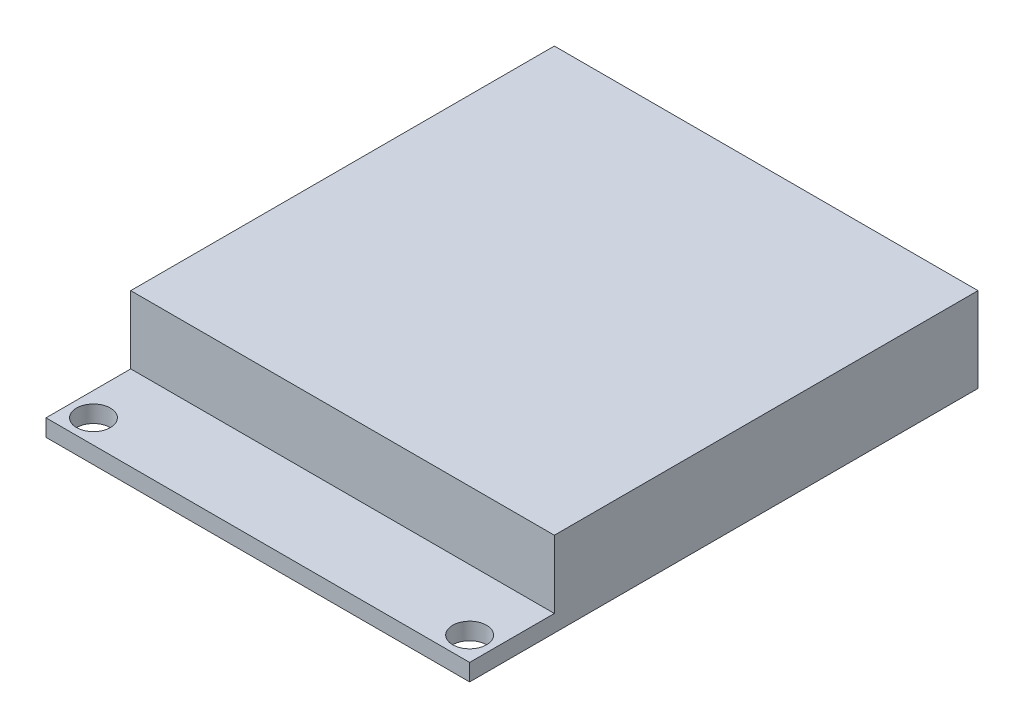
ISO-10303-21;
HEADER;
FILE_DESCRIPTION(('STEP AP214'),'2;1');
FILE_NAME('part.step','',(''),(''),'','','');
FILE_SCHEMA(('AUTOMOTIVE_DESIGN { 1 0 10303 214 1 1 1 1 }'));
ENDSEC;
DATA;
#1=APPLICATION_CONTEXT('core data for automotive mechanical design processes');
#2=APPLICATION_PROTOCOL_DEFINITION('international standard','automotive_design',2000,#1);
#3=PRODUCT_CONTEXT('',#1,'mechanical');
#4=PRODUCT('Part','Part','',(#3));
#5=PRODUCT_RELATED_PRODUCT_CATEGORY('part','',(#4));
#6=PRODUCT_DEFINITION_FORMATION('','',#4);
#7=PRODUCT_DEFINITION_CONTEXT('part definition',#1,'design');
#8=PRODUCT_DEFINITION('design','',#6,#7);
#9=PRODUCT_DEFINITION_SHAPE('','',#8);
#10=(LENGTH_UNIT() NAMED_UNIT(*) SI_UNIT(.MILLI.,.METRE.));
#11=(NAMED_UNIT(*) PLANE_ANGLE_UNIT() SI_UNIT($,.RADIAN.));
#12=(NAMED_UNIT(*) SI_UNIT($,.STERADIAN.) SOLID_ANGLE_UNIT());
#13=UNCERTAINTY_MEASURE_WITH_UNIT(LENGTH_MEASURE(1.E-05),#10,'distance_accuracy_value','');
#14=(GEOMETRIC_REPRESENTATION_CONTEXT(3) GLOBAL_UNCERTAINTY_ASSIGNED_CONTEXT((#13)) GLOBAL_UNIT_ASSIGNED_CONTEXT((#10,
#11,#12)) REPRESENTATION_CONTEXT('',''));
#15=CARTESIAN_POINT('',(0.,0.,0.));
#16=DIRECTION('',(0.,0.,1.));
#17=DIRECTION('',(1.,0.,0.));
#18=AXIS2_PLACEMENT_3D('',#15,#16,#17);
#19=CARTESIAN_POINT('',(0.,1.,0.));
#20=DIRECTION('',(0.,-1.,0.));
#21=DIRECTION('',(0.,0.,-1.));
#22=AXIS2_PLACEMENT_3D('',#19,#20,#21);
#23=PLANE('',#22);
#24=CARTESIAN_POINT('',(-11.1,1.,13.6));
#25=DIRECTION('',(0.,1.,0.));
#26=DIRECTION('',(0.,0.,1.));
#27=AXIS2_PLACEMENT_3D('',#24,#25,#26);
#28=CIRCLE('',#27,1.);
#29=CARTESIAN_POINT('',(-11.1,1.,14.6));
#30=VERTEX_POINT('',#29);
#31=EDGE_CURVE('E150',#30,#30,#28,.T.);
#32=ORIENTED_EDGE('',*,*,#31,.F.);
#33=EDGE_LOOP('',(#32));
#34=FACE_BOUND('',#33,.T.);
#35=CARTESIAN_POINT('',(11.1,1.,13.6));
#36=DIRECTION('',(0.,1.,0.));
#37=DIRECTION('',(0.,0.,1.));
#38=AXIS2_PLACEMENT_3D('',#35,#36,#37);
#39=CIRCLE('',#38,1.);
#40=CARTESIAN_POINT('',(11.1,1.,14.6));
#41=VERTEX_POINT('',#40);
#42=EDGE_CURVE('E151',#41,#41,#39,.T.);
#43=ORIENTED_EDGE('',*,*,#42,.F.);
#44=EDGE_LOOP('',(#43));
#45=FACE_BOUND('',#44,.T.);
#46=DIRECTION('',(1.,0.,0.));
#47=VECTOR('',#46,1.);
#48=CARTESIAN_POINT('',(-12.5,1.,10.));
#49=LINE('',#48,#47);
#50=CARTESIAN_POINT('',(-12.5,1.,10.));
#51=VERTEX_POINT('',#50);
#52=CARTESIAN_POINT('',(12.5,1.,10.));
#53=VERTEX_POINT('',#52);
#54=EDGE_CURVE('E51',#51,#53,#49,.T.);
#55=ORIENTED_EDGE('',*,*,#54,.F.);
#56=DIRECTION('',(0.,0.,1.));
#57=VECTOR('',#56,1.);
#58=CARTESIAN_POINT('',(-12.5,1.,15.));
#59=LINE('',#58,#57);
#60=CARTESIAN_POINT('',(-12.5,1.,15.));
#61=VERTEX_POINT('',#60);
#62=EDGE_CURVE('E137',#51,#61,#59,.T.);
#63=ORIENTED_EDGE('',*,*,#62,.T.);
#64=DIRECTION('',(1.,0.,0.));
#65=VECTOR('',#64,1.);
#66=CARTESIAN_POINT('',(-12.5,1.,15.));
#67=LINE('',#66,#65);
#68=CARTESIAN_POINT('',(12.5,1.,15.));
#69=VERTEX_POINT('',#68);
#70=EDGE_CURVE('E57',#61,#69,#67,.T.);
#71=ORIENTED_EDGE('',*,*,#70,.T.);
#72=DIRECTION('',(0.,0.,-1.));
#73=VECTOR('',#72,1.);
#74=CARTESIAN_POINT('',(12.5,1.,15.));
#75=LINE('',#74,#73);
#76=EDGE_CURVE('E86',#69,#53,#75,.T.);
#77=ORIENTED_EDGE('',*,*,#76,.T.);
#78=EDGE_LOOP('',(#55,#63,#71,#77));
#79=FACE_BOUND('',#78,.T.);
#80=ADVANCED_FACE('F36',(#34,#45,#79),#23,.F.);
#81=CARTESIAN_POINT('',(12.5,1.,15.));
#82=DIRECTION('',(-1.,0.,0.));
#83=DIRECTION('',(0.,0.,1.));
#84=AXIS2_PLACEMENT_3D('',#81,#82,#83);
#85=PLANE('',#84);
#86=DIRECTION('',(0.,0.,-1.));
#87=VECTOR('',#86,1.);
#88=CARTESIAN_POINT('',(12.5,0.,15.));
#89=LINE('',#88,#87);
#90=CARTESIAN_POINT('',(12.5,0.,15.));
#91=VERTEX_POINT('',#90);
#92=CARTESIAN_POINT('',(12.5,0.,-15.));
#93=VERTEX_POINT('',#92);
#94=EDGE_CURVE('E92',#91,#93,#89,.T.);
#95=ORIENTED_EDGE('',*,*,#94,.T.);
#96=DIRECTION('',(0.,-1.,0.));
#97=VECTOR('',#96,1.);
#98=CARTESIAN_POINT('',(12.5,1.,-15.));
#99=LINE('',#98,#97);
#100=CARTESIAN_POINT('',(12.5,5.,-15.));
#101=VERTEX_POINT('',#100);
#102=EDGE_CURVE('E11',#101,#93,#99,.T.);
#103=ORIENTED_EDGE('',*,*,#102,.F.);
#104=DIRECTION('',(0.,0.,-1.));
#105=VECTOR('',#104,1.);
#106=CARTESIAN_POINT('',(12.5,5.,-15.));
#107=LINE('',#106,#105);
#108=CARTESIAN_POINT('',(12.5,5.,10.));
#109=VERTEX_POINT('',#108);
#110=EDGE_CURVE('E128',#109,#101,#107,.T.);
#111=ORIENTED_EDGE('',*,*,#110,.F.);
#112=DIRECTION('',(0.,-1.,0.));
#113=VECTOR('',#112,1.);
#114=CARTESIAN_POINT('',(12.5,5.,10.));
#115=LINE('',#114,#113);
#116=EDGE_CURVE('E101',#109,#53,#115,.T.);
#117=ORIENTED_EDGE('',*,*,#116,.T.);
#118=ORIENTED_EDGE('',*,*,#76,.F.);
#119=DIRECTION('',(0.,-1.,0.));
#120=VECTOR('',#119,1.);
#121=CARTESIAN_POINT('',(12.5,1.,15.));
#122=LINE('',#121,#120);
#123=EDGE_CURVE('E79',#69,#91,#122,.T.);
#124=ORIENTED_EDGE('',*,*,#123,.T.);
#125=EDGE_LOOP('',(#95,#103,#111,#117,#118,#124));
#126=FACE_BOUND('',#125,.T.);
#127=ADVANCED_FACE('F38',(#126),#85,.F.);
#128=CARTESIAN_POINT('',(-12.5,1.,-15.));
#129=DIRECTION('',(0.,0.,1.));
#130=DIRECTION('',(1.,0.,0.));
#131=AXIS2_PLACEMENT_3D('',#128,#129,#130);
#132=PLANE('',#131);
#133=DIRECTION('',(-1.,0.,0.));
#134=VECTOR('',#133,1.);
#135=CARTESIAN_POINT('',(-12.5,0.,-15.));
#136=LINE('',#135,#134);
#137=CARTESIAN_POINT('',(-12.5,0.,-15.));
#138=VERTEX_POINT('',#137);
#139=EDGE_CURVE('E96',#93,#138,#136,.T.);
#140=ORIENTED_EDGE('',*,*,#139,.T.);
#141=DIRECTION('',(0.,-1.,0.));
#142=VECTOR('',#141,1.);
#143=CARTESIAN_POINT('',(-12.5,1.,-15.));
#144=LINE('',#143,#142);
#145=CARTESIAN_POINT('',(-12.5,5.,-15.));
#146=VERTEX_POINT('',#145);
#147=EDGE_CURVE('E44',#146,#138,#144,.T.);
#148=ORIENTED_EDGE('',*,*,#147,.F.);
#149=DIRECTION('',(-1.,0.,0.));
#150=VECTOR('',#149,1.);
#151=CARTESIAN_POINT('',(-12.5,5.,-15.));
#152=LINE('',#151,#150);
#153=EDGE_CURVE('E120',#101,#146,#152,.T.);
#154=ORIENTED_EDGE('',*,*,#153,.F.);
#155=ORIENTED_EDGE('',*,*,#102,.T.);
#156=EDGE_LOOP('',(#140,#148,#154,#155));
#157=FACE_BOUND('',#156,.T.);
#158=ADVANCED_FACE('F118',(#157),#132,.F.);
#159=CARTESIAN_POINT('',(-12.5,1.,15.));
#160=DIRECTION('',(1.,0.,0.));
#161=DIRECTION('',(0.,0.,-1.));
#162=AXIS2_PLACEMENT_3D('',#159,#160,#161);
#163=PLANE('',#162);
#164=DIRECTION('',(0.,0.,1.));
#165=VECTOR('',#164,1.);
#166=CARTESIAN_POINT('',(-12.5,0.,15.));
#167=LINE('',#166,#165);
#168=CARTESIAN_POINT('',(-12.5,0.,15.));
#169=VERTEX_POINT('',#168);
#170=EDGE_CURVE('E87',#138,#169,#167,.T.);
#171=ORIENTED_EDGE('',*,*,#170,.T.);
#172=DIRECTION('',(0.,-1.,0.));
#173=VECTOR('',#172,1.);
#174=CARTESIAN_POINT('',(-12.5,1.,15.));
#175=LINE('',#174,#173);
#176=EDGE_CURVE('E82',#61,#169,#175,.T.);
#177=ORIENTED_EDGE('',*,*,#176,.F.);
#178=ORIENTED_EDGE('',*,*,#62,.F.);
#179=DIRECTION('',(0.,-1.,0.));
#180=VECTOR('',#179,1.);
#181=CARTESIAN_POINT('',(-12.5,5.,10.));
#182=LINE('',#181,#180);
#183=CARTESIAN_POINT('',(-12.5,5.,10.));
#184=VERTEX_POINT('',#183);
#185=EDGE_CURVE('E97',#184,#51,#182,.T.);
#186=ORIENTED_EDGE('',*,*,#185,.F.);
#187=DIRECTION('',(0.,0.,1.));
#188=VECTOR('',#187,1.);
#189=CARTESIAN_POINT('',(-12.5,5.,-15.));
#190=LINE('',#189,#188);
#191=EDGE_CURVE('E114',#146,#184,#190,.T.);
#192=ORIENTED_EDGE('',*,*,#191,.F.);
#193=ORIENTED_EDGE('',*,*,#147,.T.);
#194=EDGE_LOOP('',(#171,#177,#178,#186,#192,#193));
#195=FACE_BOUND('',#194,.T.);
#196=ADVANCED_FACE('F111',(#195),#163,.F.);
#197=CARTESIAN_POINT('',(-12.5,1.,15.));
#198=DIRECTION('',(0.,0.,-1.));
#199=DIRECTION('',(-1.,0.,0.));
#200=AXIS2_PLACEMENT_3D('',#197,#198,#199);
#201=PLANE('',#200);
#202=DIRECTION('',(1.,0.,0.));
#203=VECTOR('',#202,1.);
#204=CARTESIAN_POINT('',(-12.5,0.,15.));
#205=LINE('',#204,#203);
#206=EDGE_CURVE('E76',#169,#91,#205,.T.);
#207=ORIENTED_EDGE('',*,*,#206,.T.);
#208=ORIENTED_EDGE('',*,*,#123,.F.);
#209=ORIENTED_EDGE('',*,*,#70,.F.);
#210=ORIENTED_EDGE('',*,*,#176,.T.);
#211=EDGE_LOOP('',(#207,#208,#209,#210));
#212=FACE_BOUND('',#211,.T.);
#213=ADVANCED_FACE('F78',(#212),#201,.F.);
#214=CARTESIAN_POINT('',(0.,0.,0.));
#215=DIRECTION('',(0.,-1.,0.));
#216=DIRECTION('',(0.,0.,-1.));
#217=AXIS2_PLACEMENT_3D('',#214,#215,#216);
#218=PLANE('',#217);
#219=CARTESIAN_POINT('',(-11.1,0.,13.6));
#220=DIRECTION('',(0.,-1.,0.));
#221=DIRECTION('',(0.,0.,-1.));
#222=AXIS2_PLACEMENT_3D('',#219,#220,#221);
#223=CIRCLE('',#222,1.);
#224=CARTESIAN_POINT('',(-11.1,0.,12.6));
#225=VERTEX_POINT('',#224);
#226=EDGE_CURVE('E135',#225,#225,#223,.F.);
#227=ORIENTED_EDGE('',*,*,#226,.T.);
#228=EDGE_LOOP('',(#227));
#229=FACE_BOUND('',#228,.T.);
#230=CARTESIAN_POINT('',(11.1,0.,13.6));
#231=DIRECTION('',(0.,-1.,0.));
#232=DIRECTION('',(0.,0.,-1.));
#233=AXIS2_PLACEMENT_3D('',#230,#231,#232);
#234=CIRCLE('',#233,1.);
#235=CARTESIAN_POINT('',(11.1,0.,12.6));
#236=VERTEX_POINT('',#235);
#237=EDGE_CURVE('E147',#236,#236,#234,.F.);
#238=ORIENTED_EDGE('',*,*,#237,.T.);
#239=EDGE_LOOP('',(#238));
#240=FACE_BOUND('',#239,.T.);
#241=ORIENTED_EDGE('',*,*,#94,.F.);
#242=ORIENTED_EDGE('',*,*,#206,.F.);
#243=ORIENTED_EDGE('',*,*,#170,.F.);
#244=ORIENTED_EDGE('',*,*,#139,.F.);
#245=EDGE_LOOP('',(#241,#242,#243,#244));
#246=FACE_BOUND('',#245,.T.);
#247=ADVANCED_FACE('F95',(#229,#240,#246),#218,.T.);
#248=CARTESIAN_POINT('',(-12.5,5.,10.));
#249=DIRECTION('',(0.,0.,-1.));
#250=DIRECTION('',(-1.,0.,0.));
#251=AXIS2_PLACEMENT_3D('',#248,#249,#250);
#252=PLANE('',#251);
#253=ORIENTED_EDGE('',*,*,#54,.T.);
#254=ORIENTED_EDGE('',*,*,#116,.F.);
#255=DIRECTION('',(1.,0.,0.));
#256=VECTOR('',#255,1.);
#257=CARTESIAN_POINT('',(-12.5,5.,10.));
#258=LINE('',#257,#256);
#259=EDGE_CURVE('E131',#184,#109,#258,.T.);
#260=ORIENTED_EDGE('',*,*,#259,.F.);
#261=ORIENTED_EDGE('',*,*,#185,.T.);
#262=EDGE_LOOP('',(#253,#254,#260,#261));
#263=FACE_BOUND('',#262,.T.);
#264=ADVANCED_FACE('F140',(#263),#252,.F.);
#265=CARTESIAN_POINT('',(0.,5.,0.));
#266=DIRECTION('',(0.,1.,0.));
#267=DIRECTION('',(0.,0.,1.));
#268=AXIS2_PLACEMENT_3D('',#265,#266,#267);
#269=PLANE('',#268);
#270=ORIENTED_EDGE('',*,*,#191,.T.);
#271=ORIENTED_EDGE('',*,*,#259,.T.);
#272=ORIENTED_EDGE('',*,*,#110,.T.);
#273=ORIENTED_EDGE('',*,*,#153,.T.);
#274=EDGE_LOOP('',(#270,#271,#272,#273));
#275=FACE_BOUND('',#274,.T.);
#276=ADVANCED_FACE('F124',(#275),#269,.T.);
#277=CARTESIAN_POINT('',(11.1,-2.8284271247462,13.6));
#278=DIRECTION('',(0.,1.,0.));
#279=DIRECTION('',(0.,0.,1.));
#280=AXIS2_PLACEMENT_3D('',#277,#278,#279);
#281=CYLINDRICAL_SURFACE('',#280,1.);
#282=ORIENTED_EDGE('',*,*,#42,.T.);
#283=EDGE_LOOP('',(#282));
#284=FACE_BOUND('',#283,.T.);
#285=ORIENTED_EDGE('',*,*,#237,.F.);
#286=EDGE_LOOP('',(#285));
#287=FACE_BOUND('',#286,.T.);
#288=ADVANCED_FACE('F167',(#284,#287),#281,.F.);
#289=CARTESIAN_POINT('',(-11.1,-2.8284271247462,13.6));
#290=DIRECTION('',(0.,1.,0.));
#291=DIRECTION('',(0.,0.,1.));
#292=AXIS2_PLACEMENT_3D('',#289,#290,#291);
#293=CYLINDRICAL_SURFACE('',#292,1.);
#294=ORIENTED_EDGE('',*,*,#31,.T.);
#295=EDGE_LOOP('',(#294));
#296=FACE_BOUND('',#295,.T.);
#297=ORIENTED_EDGE('',*,*,#226,.F.);
#298=EDGE_LOOP('',(#297));
#299=FACE_BOUND('',#298,.T.);
#300=ADVANCED_FACE('F159',(#296,#299),#293,.F.);
#301=CLOSED_SHELL('',(#80,#127,#158,#196,#213,#247,#264,#276,#288,#300));
#302=MANIFOLD_SOLID_BREP('B2',#301);
#303=ADVANCED_BREP_SHAPE_REPRESENTATION('',(#18,#302),#14);
#304=SHAPE_DEFINITION_REPRESENTATION(#9,#303);
ENDSEC;
END-ISO-10303-21;
